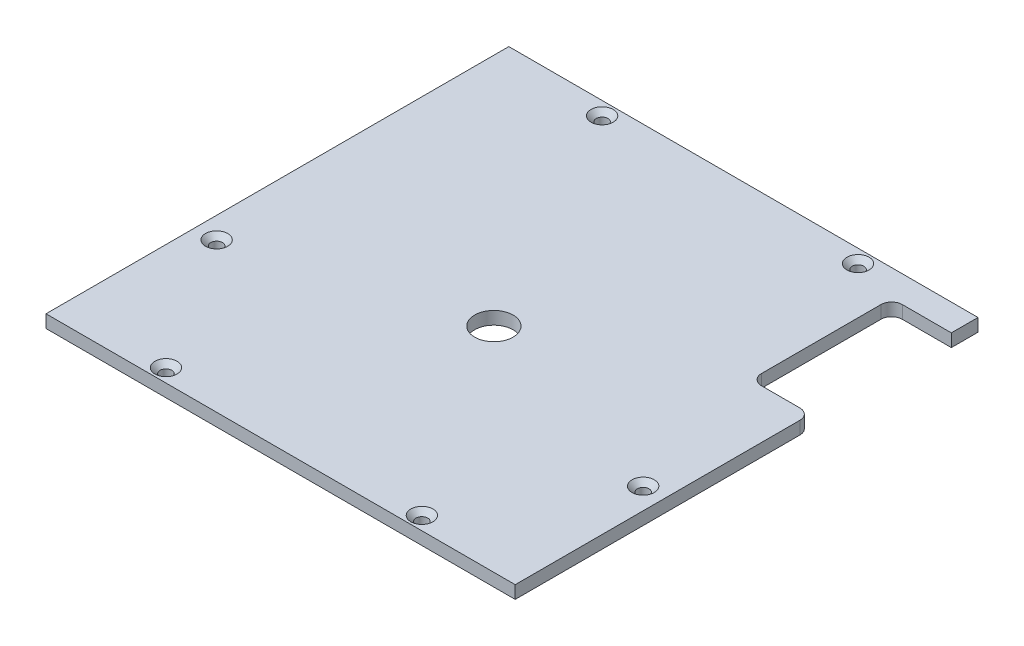
ISO-10303-21;
HEADER;
FILE_DESCRIPTION(('STEP AP214'),'2;1');
FILE_NAME('part.step','',(''),(''),'','','');
FILE_SCHEMA(('AUTOMOTIVE_DESIGN { 1 0 10303 214 1 1 1 1 }'));
ENDSEC;
DATA;
#1=APPLICATION_CONTEXT('core data for automotive mechanical design processes');
#2=APPLICATION_PROTOCOL_DEFINITION('international standard','automotive_design',2000,#1);
#3=PRODUCT_CONTEXT('',#1,'mechanical');
#4=PRODUCT('Part','Part','',(#3));
#5=PRODUCT_RELATED_PRODUCT_CATEGORY('part','',(#4));
#6=PRODUCT_DEFINITION_FORMATION('','',#4);
#7=PRODUCT_DEFINITION_CONTEXT('part definition',#1,'design');
#8=PRODUCT_DEFINITION('design','',#6,#7);
#9=PRODUCT_DEFINITION_SHAPE('','',#8);
#10=(LENGTH_UNIT() NAMED_UNIT(*) SI_UNIT(.MILLI.,.METRE.));
#11=(NAMED_UNIT(*) PLANE_ANGLE_UNIT() SI_UNIT($,.RADIAN.));
#12=(NAMED_UNIT(*) SI_UNIT($,.STERADIAN.) SOLID_ANGLE_UNIT());
#13=UNCERTAINTY_MEASURE_WITH_UNIT(LENGTH_MEASURE(1.E-05),#10,'distance_accuracy_value','');
#14=(GEOMETRIC_REPRESENTATION_CONTEXT(3) GLOBAL_UNCERTAINTY_ASSIGNED_CONTEXT((#13)) GLOBAL_UNIT_ASSIGNED_CONTEXT((#10,
#11,#12)) REPRESENTATION_CONTEXT('',''));
#15=CARTESIAN_POINT('',(0.,0.,0.));
#16=DIRECTION('',(0.,0.,1.));
#17=DIRECTION('',(1.,0.,0.));
#18=AXIS2_PLACEMENT_3D('',#15,#16,#17);
#19=CARTESIAN_POINT('',(0.,6.,0.));
#20=DIRECTION('',(0.,-1.,0.));
#21=DIRECTION('',(0.,0.,-1.));
#22=AXIS2_PLACEMENT_3D('',#19,#20,#21);
#23=PLANE('',#22);
#24=CARTESIAN_POINT('',(-100.,6.,38.5));
#25=DIRECTION('',(0.,1.,0.));
#26=DIRECTION('',(0.,0.,1.));
#27=AXIS2_PLACEMENT_3D('',#24,#25,#26);
#28=CIRCLE('',#27,5.2);
#29=CARTESIAN_POINT('',(-100.,6.,43.7));
#30=VERTEX_POINT('',#29);
#31=EDGE_CURVE('E486',#30,#30,#28,.T.);
#32=ORIENTED_EDGE('',*,*,#31,.F.);
#33=EDGE_LOOP('',(#32));
#34=FACE_BOUND('',#33,.T.);
#35=CARTESIAN_POINT('',(-60.,6.,102.25));
#36=DIRECTION('',(0.,1.,0.));
#37=DIRECTION('',(0.,0.,1.));
#38=AXIS2_PLACEMENT_3D('',#35,#36,#37);
#39=CIRCLE('',#38,5.2);
#40=CARTESIAN_POINT('',(-60.,6.,107.45));
#41=VERTEX_POINT('',#40);
#42=EDGE_CURVE('E493',#41,#41,#39,.T.);
#43=ORIENTED_EDGE('',*,*,#42,.F.);
#44=EDGE_LOOP('',(#43));
#45=FACE_BOUND('',#44,.T.);
#46=CARTESIAN_POINT('',(60.,6.,102.25));
#47=DIRECTION('',(0.,1.,0.));
#48=DIRECTION('',(0.,0.,1.));
#49=AXIS2_PLACEMENT_3D('',#46,#47,#48);
#50=CIRCLE('',#49,5.2);
#51=CARTESIAN_POINT('',(60.,6.,107.45));
#52=VERTEX_POINT('',#51);
#53=EDGE_CURVE('E502',#52,#52,#50,.T.);
#54=ORIENTED_EDGE('',*,*,#53,.F.);
#55=EDGE_LOOP('',(#54));
#56=FACE_BOUND('',#55,.T.);
#57=CARTESIAN_POINT('',(100.,6.,38.5));
#58=DIRECTION('',(0.,1.,0.));
#59=DIRECTION('',(0.,0.,1.));
#60=AXIS2_PLACEMENT_3D('',#57,#58,#59);
#61=CIRCLE('',#60,5.2);
#62=CARTESIAN_POINT('',(100.,6.,43.7));
#63=VERTEX_POINT('',#62);
#64=EDGE_CURVE('E511',#63,#63,#61,.T.);
#65=ORIENTED_EDGE('',*,*,#64,.F.);
#66=EDGE_LOOP('',(#65));
#67=FACE_BOUND('',#66,.T.);
#68=CARTESIAN_POINT('',(60.,6.,-102.25));
#69=DIRECTION('',(0.,1.,0.));
#70=DIRECTION('',(0.,0.,1.));
#71=AXIS2_PLACEMENT_3D('',#68,#69,#70);
#72=CIRCLE('',#71,5.2);
#73=CARTESIAN_POINT('',(60.,6.,-97.05));
#74=VERTEX_POINT('',#73);
#75=EDGE_CURVE('E529',#74,#74,#72,.T.);
#76=ORIENTED_EDGE('',*,*,#75,.F.);
#77=EDGE_LOOP('',(#76));
#78=FACE_BOUND('',#77,.T.);
#79=CARTESIAN_POINT('',(0.,6.,8.49999999999996));
#80=DIRECTION('',(0.,1.,0.));
#81=DIRECTION('',(0.,0.,1.));
#82=AXIS2_PLACEMENT_3D('',#79,#80,#81);
#83=CIRCLE('',#82,9.);
#84=CARTESIAN_POINT('',(0.,6.,17.5));
#85=VERTEX_POINT('',#84);
#86=EDGE_CURVE('E210',#85,#85,#83,.T.);
#87=ORIENTED_EDGE('',*,*,#86,.F.);
#88=EDGE_LOOP('',(#87));
#89=FACE_BOUND('',#88,.T.);
#90=DIRECTION('',(0.,0.,-1.));
#91=VECTOR('',#90,1.);
#92=CARTESIAN_POINT('',(110.,6.,108.5));
#93=LINE('',#92,#91);
#94=CARTESIAN_POINT('',(110.,6.,108.5));
#95=VERTEX_POINT('',#94);
#96=CARTESIAN_POINT('',(110.,6.,-25.));
#97=VERTEX_POINT('',#96);
#98=EDGE_CURVE('E213',#95,#97,#93,.T.);
#99=ORIENTED_EDGE('',*,*,#98,.T.);
#100=CARTESIAN_POINT('',(105.,6.,-25.));
#101=DIRECTION('',(0.,-1.,0.));
#102=DIRECTION('',(0.,0.,-1.));
#103=AXIS2_PLACEMENT_3D('',#100,#101,#102);
#104=CIRCLE('',#103,5.);
#105=CARTESIAN_POINT('',(105.,6.,-30.));
#106=VERTEX_POINT('',#105);
#107=EDGE_CURVE('E168',#97,#106,#104,.F.);
#108=ORIENTED_EDGE('',*,*,#107,.T.);
#109=DIRECTION('',(1.,0.,0.));
#110=VECTOR('',#109,1.);
#111=CARTESIAN_POINT('',(82.,6.,-30.));
#112=LINE('',#111,#110);
#113=CARTESIAN_POINT('',(87.,6.,-30.));
#114=VERTEX_POINT('',#113);
#115=EDGE_CURVE('E194',#114,#106,#112,.T.);
#116=ORIENTED_EDGE('',*,*,#115,.F.);
#117=CARTESIAN_POINT('',(87.,6.,-35.));
#118=DIRECTION('',(0.,-1.,0.));
#119=DIRECTION('',(0.,0.,-1.));
#120=AXIS2_PLACEMENT_3D('',#117,#118,#119);
#121=CIRCLE('',#120,5.);
#122=CARTESIAN_POINT('',(82.,6.,-35.));
#123=VERTEX_POINT('',#122);
#124=EDGE_CURVE('E182',#114,#123,#121,.T.);
#125=ORIENTED_EDGE('',*,*,#124,.T.);
#126=DIRECTION('',(0.,0.,1.));
#127=VECTOR('',#126,1.);
#128=CARTESIAN_POINT('',(82.,6.,-96.));
#129=LINE('',#128,#127);
#130=CARTESIAN_POINT('',(82.,6.,-91.));
#131=VERTEX_POINT('',#130);
#132=EDGE_CURVE('E190',#131,#123,#129,.T.);
#133=ORIENTED_EDGE('',*,*,#132,.F.);
#134=CARTESIAN_POINT('',(87.,6.,-91.));
#135=DIRECTION('',(0.,-1.,0.));
#136=DIRECTION('',(0.,0.,-1.));
#137=AXIS2_PLACEMENT_3D('',#134,#135,#136);
#138=CIRCLE('',#137,5.);
#139=CARTESIAN_POINT('',(87.,6.,-96.));
#140=VERTEX_POINT('',#139);
#141=EDGE_CURVE('E44',#131,#140,#138,.T.);
#142=ORIENTED_EDGE('',*,*,#141,.T.);
#143=DIRECTION('',(-1.,0.,0.));
#144=VECTOR('',#143,1.);
#145=CARTESIAN_POINT('',(82.,6.,-96.));
#146=LINE('',#145,#144);
#147=CARTESIAN_POINT('',(110.,6.,-96.));
#148=VERTEX_POINT('',#147);
#149=EDGE_CURVE('E189',#148,#140,#146,.T.);
#150=ORIENTED_EDGE('',*,*,#149,.F.);
#151=CARTESIAN_POINT('',(110.,6.,-108.5));
#152=VERTEX_POINT('',#151);
#153=EDGE_CURVE('E134',#148,#152,#93,.T.);
#154=ORIENTED_EDGE('',*,*,#153,.T.);
#155=DIRECTION('',(-1.,0.,0.));
#156=VECTOR('',#155,1.);
#157=CARTESIAN_POINT('',(-110.,6.,-108.5));
#158=LINE('',#157,#156);
#159=CARTESIAN_POINT('',(-110.,6.,-108.5));
#160=VERTEX_POINT('',#159);
#161=EDGE_CURVE('E215',#152,#160,#158,.T.);
#162=ORIENTED_EDGE('',*,*,#161,.T.);
#163=DIRECTION('',(0.,0.,1.));
#164=VECTOR('',#163,1.);
#165=CARTESIAN_POINT('',(-110.,6.,108.5));
#166=LINE('',#165,#164);
#167=CARTESIAN_POINT('',(-110.,6.,108.5));
#168=VERTEX_POINT('',#167);
#169=EDGE_CURVE('E216',#160,#168,#166,.T.);
#170=ORIENTED_EDGE('',*,*,#169,.T.);
#171=DIRECTION('',(1.,0.,0.));
#172=VECTOR('',#171,1.);
#173=CARTESIAN_POINT('',(-110.,6.,108.5));
#174=LINE('',#173,#172);
#175=EDGE_CURVE('E147',#168,#95,#174,.T.);
#176=ORIENTED_EDGE('',*,*,#175,.T.);
#177=EDGE_LOOP('',(#99,#108,#116,#125,#133,#142,#150,#154,#162,#170,#176));
#178=FACE_BOUND('',#177,.T.);
#179=CARTESIAN_POINT('',(-60.,6.,-102.25));
#180=DIRECTION('',(0.,1.,0.));
#181=DIRECTION('',(0.,0.,1.));
#182=AXIS2_PLACEMENT_3D('',#179,#180,#181);
#183=CIRCLE('',#182,5.2);
#184=CARTESIAN_POINT('',(-60.,6.,-97.05));
#185=VERTEX_POINT('',#184);
#186=EDGE_CURVE('E520',#185,#185,#183,.T.);
#187=ORIENTED_EDGE('',*,*,#186,.F.);
#188=EDGE_LOOP('',(#187));
#189=FACE_BOUND('',#188,.T.);
#190=ADVANCED_FACE('F36',(#34,#45,#56,#67,#78,#89,#178,#189),#23,.F.);
#191=CARTESIAN_POINT('',(110.,6.,108.5));
#192=DIRECTION('',(-1.,0.,0.));
#193=DIRECTION('',(0.,0.,1.));
#194=AXIS2_PLACEMENT_3D('',#191,#192,#193);
#195=PLANE('',#194);
#196=ORIENTED_EDGE('',*,*,#153,.F.);
#197=DIRECTION('',(0.,1.,0.));
#198=VECTOR('',#197,1.);
#199=CARTESIAN_POINT('',(110.,0.,-96.));
#200=LINE('',#199,#198);
#201=CARTESIAN_POINT('',(110.,0.,-96.));
#202=VERTEX_POINT('',#201);
#203=EDGE_CURVE('E121',#202,#148,#200,.T.);
#204=ORIENTED_EDGE('',*,*,#203,.F.);
#205=DIRECTION('',(0.,0.,-1.));
#206=VECTOR('',#205,1.);
#207=CARTESIAN_POINT('',(110.,0.,108.5));
#208=LINE('',#207,#206);
#209=CARTESIAN_POINT('',(110.,0.,-108.5));
#210=VERTEX_POINT('',#209);
#211=EDGE_CURVE('E132',#202,#210,#208,.T.);
#212=ORIENTED_EDGE('',*,*,#211,.T.);
#213=DIRECTION('',(0.,-1.,0.));
#214=VECTOR('',#213,1.);
#215=CARTESIAN_POINT('',(110.,6.,-108.5));
#216=LINE('',#215,#214);
#217=EDGE_CURVE('E163',#152,#210,#216,.T.);
#218=ORIENTED_EDGE('',*,*,#217,.F.);
#219=EDGE_LOOP('',(#196,#204,#212,#218));
#220=FACE_BOUND('',#219,.T.);
#221=ADVANCED_FACE('F130',(#220),#195,.F.);
#222=CARTESIAN_POINT('',(110.,0.,108.5));
#223=VERTEX_POINT('',#222);
#224=CARTESIAN_POINT('',(110.,0.,-25.));
#225=VERTEX_POINT('',#224);
#226=EDGE_CURVE('E142',#223,#225,#208,.T.);
#227=ORIENTED_EDGE('',*,*,#226,.T.);
#228=DIRECTION('',(0.,1.,0.));
#229=VECTOR('',#228,1.);
#230=CARTESIAN_POINT('',(110.,6.,-25.));
#231=LINE('',#230,#229);
#232=EDGE_CURVE('E165',#225,#97,#231,.T.);
#233=ORIENTED_EDGE('',*,*,#232,.T.);
#234=ORIENTED_EDGE('',*,*,#98,.F.);
#235=DIRECTION('',(0.,-1.,0.));
#236=VECTOR('',#235,1.);
#237=CARTESIAN_POINT('',(110.,6.,108.5));
#238=LINE('',#237,#236);
#239=EDGE_CURVE('E154',#95,#223,#238,.T.);
#240=ORIENTED_EDGE('',*,*,#239,.T.);
#241=EDGE_LOOP('',(#227,#233,#234,#240));
#242=FACE_BOUND('',#241,.T.);
#243=ADVANCED_FACE('F227',(#242),#195,.F.);
#244=CARTESIAN_POINT('',(-110.,6.,-108.5));
#245=DIRECTION('',(0.,0.,1.));
#246=DIRECTION('',(1.,0.,0.));
#247=AXIS2_PLACEMENT_3D('',#244,#245,#246);
#248=PLANE('',#247);
#249=DIRECTION('',(-1.,0.,0.));
#250=VECTOR('',#249,1.);
#251=CARTESIAN_POINT('',(-110.,0.,-108.5));
#252=LINE('',#251,#250);
#253=CARTESIAN_POINT('',(-110.,0.,-108.5));
#254=VERTEX_POINT('',#253);
#255=EDGE_CURVE('E140',#210,#254,#252,.T.);
#256=ORIENTED_EDGE('',*,*,#255,.T.);
#257=DIRECTION('',(0.,-1.,0.));
#258=VECTOR('',#257,1.);
#259=CARTESIAN_POINT('',(-110.,6.,-108.5));
#260=LINE('',#259,#258);
#261=EDGE_CURVE('E160',#160,#254,#260,.T.);
#262=ORIENTED_EDGE('',*,*,#261,.F.);
#263=ORIENTED_EDGE('',*,*,#161,.F.);
#264=ORIENTED_EDGE('',*,*,#217,.T.);
#265=EDGE_LOOP('',(#256,#262,#263,#264));
#266=FACE_BOUND('',#265,.T.);
#267=ADVANCED_FACE('F245',(#266),#248,.F.);
#268=CARTESIAN_POINT('',(-110.,6.,108.5));
#269=DIRECTION('',(1.,0.,0.));
#270=DIRECTION('',(0.,0.,-1.));
#271=AXIS2_PLACEMENT_3D('',#268,#269,#270);
#272=PLANE('',#271);
#273=DIRECTION('',(0.,0.,1.));
#274=VECTOR('',#273,1.);
#275=CARTESIAN_POINT('',(-110.,0.,108.5));
#276=LINE('',#275,#274);
#277=CARTESIAN_POINT('',(-110.,0.,108.5));
#278=VERTEX_POINT('',#277);
#279=EDGE_CURVE('E150',#254,#278,#276,.T.);
#280=ORIENTED_EDGE('',*,*,#279,.T.);
#281=DIRECTION('',(0.,-1.,0.));
#282=VECTOR('',#281,1.);
#283=CARTESIAN_POINT('',(-110.,6.,108.5));
#284=LINE('',#283,#282);
#285=EDGE_CURVE('E157',#168,#278,#284,.T.);
#286=ORIENTED_EDGE('',*,*,#285,.F.);
#287=ORIENTED_EDGE('',*,*,#169,.F.);
#288=ORIENTED_EDGE('',*,*,#261,.T.);
#289=EDGE_LOOP('',(#280,#286,#287,#288));
#290=FACE_BOUND('',#289,.T.);
#291=ADVANCED_FACE('F241',(#290),#272,.F.);
#292=CARTESIAN_POINT('',(-110.,6.,108.5));
#293=DIRECTION('',(0.,0.,-1.));
#294=DIRECTION('',(-1.,0.,0.));
#295=AXIS2_PLACEMENT_3D('',#292,#293,#294);
#296=PLANE('',#295);
#297=DIRECTION('',(1.,0.,0.));
#298=VECTOR('',#297,1.);
#299=CARTESIAN_POINT('',(-110.,0.,108.5));
#300=LINE('',#299,#298);
#301=EDGE_CURVE('E152',#278,#223,#300,.T.);
#302=ORIENTED_EDGE('',*,*,#301,.T.);
#303=ORIENTED_EDGE('',*,*,#239,.F.);
#304=ORIENTED_EDGE('',*,*,#175,.F.);
#305=ORIENTED_EDGE('',*,*,#285,.T.);
#306=EDGE_LOOP('',(#302,#303,#304,#305));
#307=FACE_BOUND('',#306,.T.);
#308=ADVANCED_FACE('F223',(#307),#296,.F.);
#309=CARTESIAN_POINT('',(0.,0.,0.));
#310=DIRECTION('',(0.,-1.,0.));
#311=DIRECTION('',(0.,0.,-1.));
#312=AXIS2_PLACEMENT_3D('',#309,#310,#311);
#313=PLANE('',#312);
#314=CARTESIAN_POINT('',(-100.,0.,38.5));
#315=DIRECTION('',(0.,1.,0.));
#316=DIRECTION('',(0.,0.,1.));
#317=AXIS2_PLACEMENT_3D('',#314,#315,#316);
#318=CIRCLE('',#317,2.74999999999999);
#319=CARTESIAN_POINT('',(-100.,0.,41.25));
#320=VERTEX_POINT('',#319);
#321=EDGE_CURVE('E488',#320,#320,#318,.T.);
#322=ORIENTED_EDGE('',*,*,#321,.T.);
#323=EDGE_LOOP('',(#322));
#324=FACE_BOUND('',#323,.T.);
#325=CARTESIAN_POINT('',(-60.,0.,102.25));
#326=DIRECTION('',(0.,1.,0.));
#327=DIRECTION('',(0.,0.,1.));
#328=AXIS2_PLACEMENT_3D('',#325,#326,#327);
#329=CIRCLE('',#328,2.74999999999999);
#330=CARTESIAN_POINT('',(-60.,0.,105.));
#331=VERTEX_POINT('',#330);
#332=EDGE_CURVE('E499',#331,#331,#329,.T.);
#333=ORIENTED_EDGE('',*,*,#332,.T.);
#334=EDGE_LOOP('',(#333));
#335=FACE_BOUND('',#334,.T.);
#336=CARTESIAN_POINT('',(60.,0.,102.25));
#337=DIRECTION('',(0.,1.,0.));
#338=DIRECTION('',(0.,0.,1.));
#339=AXIS2_PLACEMENT_3D('',#336,#337,#338);
#340=CIRCLE('',#339,2.74999999999999);
#341=CARTESIAN_POINT('',(60.,0.,105.));
#342=VERTEX_POINT('',#341);
#343=EDGE_CURVE('E508',#342,#342,#340,.T.);
#344=ORIENTED_EDGE('',*,*,#343,.T.);
#345=EDGE_LOOP('',(#344));
#346=FACE_BOUND('',#345,.T.);
#347=CARTESIAN_POINT('',(100.,0.,38.5));
#348=DIRECTION('',(0.,1.,0.));
#349=DIRECTION('',(0.,0.,1.));
#350=AXIS2_PLACEMENT_3D('',#347,#348,#349);
#351=CIRCLE('',#350,2.74999999999999);
#352=CARTESIAN_POINT('',(100.,0.,41.25));
#353=VERTEX_POINT('',#352);
#354=EDGE_CURVE('E517',#353,#353,#351,.T.);
#355=ORIENTED_EDGE('',*,*,#354,.T.);
#356=EDGE_LOOP('',(#355));
#357=FACE_BOUND('',#356,.T.);
#358=CARTESIAN_POINT('',(-60.,0.,-102.25));
#359=DIRECTION('',(0.,1.,0.));
#360=DIRECTION('',(0.,0.,1.));
#361=AXIS2_PLACEMENT_3D('',#358,#359,#360);
#362=CIRCLE('',#361,2.74999999999999);
#363=CARTESIAN_POINT('',(-60.,0.,-99.5));
#364=VERTEX_POINT('',#363);
#365=EDGE_CURVE('E526',#364,#364,#362,.T.);
#366=ORIENTED_EDGE('',*,*,#365,.T.);
#367=EDGE_LOOP('',(#366));
#368=FACE_BOUND('',#367,.T.);
#369=CARTESIAN_POINT('',(60.,0.,-102.25));
#370=DIRECTION('',(0.,1.,0.));
#371=DIRECTION('',(0.,0.,1.));
#372=AXIS2_PLACEMENT_3D('',#369,#370,#371);
#373=CIRCLE('',#372,2.74999999999999);
#374=CARTESIAN_POINT('',(60.,0.,-99.5));
#375=VERTEX_POINT('',#374);
#376=EDGE_CURVE('E201',#375,#375,#373,.T.);
#377=ORIENTED_EDGE('',*,*,#376,.T.);
#378=EDGE_LOOP('',(#377));
#379=FACE_BOUND('',#378,.T.);
#380=DIRECTION('',(1.,0.,0.));
#381=VECTOR('',#380,1.);
#382=CARTESIAN_POINT('',(82.,0.,-30.));
#383=LINE('',#382,#381);
#384=CARTESIAN_POINT('',(87.,0.,-30.));
#385=VERTEX_POINT('',#384);
#386=CARTESIAN_POINT('',(105.,0.,-30.));
#387=VERTEX_POINT('',#386);
#388=EDGE_CURVE('E126',#385,#387,#383,.T.);
#389=ORIENTED_EDGE('',*,*,#388,.T.);
#390=CARTESIAN_POINT('',(105.,0.,-25.));
#391=DIRECTION('',(0.,-1.,0.));
#392=DIRECTION('',(0.,0.,-1.));
#393=AXIS2_PLACEMENT_3D('',#390,#391,#392);
#394=CIRCLE('',#393,5.);
#395=EDGE_CURVE('E175',#387,#225,#394,.T.);
#396=ORIENTED_EDGE('',*,*,#395,.T.);
#397=ORIENTED_EDGE('',*,*,#226,.F.);
#398=ORIENTED_EDGE('',*,*,#301,.F.);
#399=ORIENTED_EDGE('',*,*,#279,.F.);
#400=ORIENTED_EDGE('',*,*,#255,.F.);
#401=ORIENTED_EDGE('',*,*,#211,.F.);
#402=DIRECTION('',(-1.,0.,0.));
#403=VECTOR('',#402,1.);
#404=CARTESIAN_POINT('',(82.,0.,-96.));
#405=LINE('',#404,#403);
#406=CARTESIAN_POINT('',(87.,0.,-96.));
#407=VERTEX_POINT('',#406);
#408=EDGE_CURVE('E117',#202,#407,#405,.T.);
#409=ORIENTED_EDGE('',*,*,#408,.T.);
#410=CARTESIAN_POINT('',(87.,0.,-91.));
#411=DIRECTION('',(0.,-1.,0.));
#412=DIRECTION('',(0.,0.,-1.));
#413=AXIS2_PLACEMENT_3D('',#410,#411,#412);
#414=CIRCLE('',#413,5.);
#415=CARTESIAN_POINT('',(82.,0.,-91.));
#416=VERTEX_POINT('',#415);
#417=EDGE_CURVE('E11',#407,#416,#414,.F.);
#418=ORIENTED_EDGE('',*,*,#417,.T.);
#419=DIRECTION('',(0.,0.,1.));
#420=VECTOR('',#419,1.);
#421=CARTESIAN_POINT('',(82.,0.,-96.));
#422=LINE('',#421,#420);
#423=CARTESIAN_POINT('',(82.,0.,-35.));
#424=VERTEX_POINT('',#423);
#425=EDGE_CURVE('E193',#416,#424,#422,.T.);
#426=ORIENTED_EDGE('',*,*,#425,.T.);
#427=CARTESIAN_POINT('',(87.,0.,-35.));
#428=DIRECTION('',(0.,-1.,0.));
#429=DIRECTION('',(0.,0.,-1.));
#430=AXIS2_PLACEMENT_3D('',#427,#428,#429);
#431=CIRCLE('',#430,5.);
#432=EDGE_CURVE('E184',#424,#385,#431,.F.);
#433=ORIENTED_EDGE('',*,*,#432,.T.);
#434=EDGE_LOOP('',(#389,#396,#397,#398,#399,#400,#401,#409,#418,#426,#433));
#435=FACE_BOUND('',#434,.T.);
#436=CARTESIAN_POINT('',(0.,0.,8.49999999999996));
#437=DIRECTION('',(0.,1.,0.));
#438=DIRECTION('',(0.,0.,1.));
#439=AXIS2_PLACEMENT_3D('',#436,#437,#438);
#440=CIRCLE('',#439,9.);
#441=CARTESIAN_POINT('',(0.,0.,17.5));
#442=VERTEX_POINT('',#441);
#443=EDGE_CURVE('E205',#442,#442,#440,.T.);
#444=ORIENTED_EDGE('',*,*,#443,.T.);
#445=EDGE_LOOP('',(#444));
#446=FACE_BOUND('',#445,.T.);
#447=ADVANCED_FACE('F137',(#324,#335,#346,#357,#368,#379,#435,#446),#313,.T.);
#448=CARTESIAN_POINT('',(0.,0.,8.49999999999996));
#449=DIRECTION('',(0.,1.,0.));
#450=DIRECTION('',(0.,0.,1.));
#451=AXIS2_PLACEMENT_3D('',#448,#449,#450);
#452=CYLINDRICAL_SURFACE('',#451,9.);
#453=ORIENTED_EDGE('',*,*,#443,.F.);
#454=EDGE_LOOP('',(#453));
#455=FACE_BOUND('',#454,.T.);
#456=ORIENTED_EDGE('',*,*,#86,.T.);
#457=EDGE_LOOP('',(#456));
#458=FACE_BOUND('',#457,.T.);
#459=ADVANCED_FACE('F264',(#455,#458),#452,.F.);
#460=CARTESIAN_POINT('',(82.,0.,-96.));
#461=DIRECTION('',(-1.,0.,0.));
#462=DIRECTION('',(0.,0.,1.));
#463=AXIS2_PLACEMENT_3D('',#460,#461,#462);
#464=PLANE('',#463);
#465=ORIENTED_EDGE('',*,*,#132,.T.);
#466=DIRECTION('',(0.,1.,0.));
#467=VECTOR('',#466,1.);
#468=CARTESIAN_POINT('',(82.,0.,-35.));
#469=LINE('',#468,#467);
#470=EDGE_CURVE('E51',#123,#424,#469,.F.);
#471=ORIENTED_EDGE('',*,*,#470,.T.);
#472=ORIENTED_EDGE('',*,*,#425,.F.);
#473=DIRECTION('',(0.,1.,0.));
#474=VECTOR('',#473,1.);
#475=CARTESIAN_POINT('',(82.,6.,-91.));
#476=LINE('',#475,#474);
#477=EDGE_CURVE('E177',#416,#131,#476,.T.);
#478=ORIENTED_EDGE('',*,*,#477,.T.);
#479=EDGE_LOOP('',(#465,#471,#472,#478));
#480=FACE_BOUND('',#479,.T.);
#481=ADVANCED_FACE('F196',(#480),#464,.F.);
#482=CARTESIAN_POINT('',(82.,0.,-96.));
#483=DIRECTION('',(0.,0.,-1.));
#484=DIRECTION('',(-1.,0.,0.));
#485=AXIS2_PLACEMENT_3D('',#482,#483,#484);
#486=PLANE('',#485);
#487=ORIENTED_EDGE('',*,*,#149,.T.);
#488=DIRECTION('',(0.,1.,0.));
#489=VECTOR('',#488,1.);
#490=CARTESIAN_POINT('',(87.,0.,-96.));
#491=LINE('',#490,#489);
#492=EDGE_CURVE('E124',#140,#407,#491,.F.);
#493=ORIENTED_EDGE('',*,*,#492,.T.);
#494=ORIENTED_EDGE('',*,*,#408,.F.);
#495=ORIENTED_EDGE('',*,*,#203,.T.);
#496=EDGE_LOOP('',(#487,#493,#494,#495));
#497=FACE_BOUND('',#496,.T.);
#498=ADVANCED_FACE('F120',(#497),#486,.F.);
#499=CARTESIAN_POINT('',(82.,0.,-30.));
#500=DIRECTION('',(0.,0.,1.));
#501=DIRECTION('',(1.,0.,0.));
#502=AXIS2_PLACEMENT_3D('',#499,#500,#501);
#503=PLANE('',#502);
#504=ORIENTED_EDGE('',*,*,#115,.T.);
#505=DIRECTION('',(0.,1.,0.));
#506=VECTOR('',#505,1.);
#507=CARTESIAN_POINT('',(105.,0.,-30.));
#508=LINE('',#507,#506);
#509=EDGE_CURVE('E173',#106,#387,#508,.F.);
#510=ORIENTED_EDGE('',*,*,#509,.T.);
#511=ORIENTED_EDGE('',*,*,#388,.F.);
#512=DIRECTION('',(0.,1.,0.));
#513=VECTOR('',#512,1.);
#514=CARTESIAN_POINT('',(87.,6.,-30.));
#515=LINE('',#514,#513);
#516=EDGE_CURVE('E170',#385,#114,#515,.T.);
#517=ORIENTED_EDGE('',*,*,#516,.T.);
#518=EDGE_LOOP('',(#504,#510,#511,#517));
#519=FACE_BOUND('',#518,.T.);
#520=ADVANCED_FACE('F235',(#519),#503,.F.);
#521=CARTESIAN_POINT('',(105.,6.,-25.));
#522=DIRECTION('',(0.,1.,0.));
#523=DIRECTION('',(0.,0.,1.));
#524=AXIS2_PLACEMENT_3D('',#521,#522,#523);
#525=CYLINDRICAL_SURFACE('',#524,5.);
#526=ORIENTED_EDGE('',*,*,#395,.F.);
#527=ORIENTED_EDGE('',*,*,#509,.F.);
#528=ORIENTED_EDGE('',*,*,#107,.F.);
#529=ORIENTED_EDGE('',*,*,#232,.F.);
#530=EDGE_LOOP('',(#526,#527,#528,#529));
#531=FACE_BOUND('',#530,.T.);
#532=ADVANCED_FACE('F231',(#531),#525,.T.);
#533=CARTESIAN_POINT('',(87.,0.,-35.));
#534=DIRECTION('',(0.,-1.,0.));
#535=DIRECTION('',(0.,0.,-1.));
#536=AXIS2_PLACEMENT_3D('',#533,#534,#535);
#537=CYLINDRICAL_SURFACE('',#536,5.);
#538=ORIENTED_EDGE('',*,*,#432,.F.);
#539=ORIENTED_EDGE('',*,*,#470,.F.);
#540=ORIENTED_EDGE('',*,*,#124,.F.);
#541=ORIENTED_EDGE('',*,*,#516,.F.);
#542=EDGE_LOOP('',(#538,#539,#540,#541));
#543=FACE_BOUND('',#542,.T.);
#544=ADVANCED_FACE('F239',(#543),#537,.F.);
#545=CARTESIAN_POINT('',(87.,0.,-91.));
#546=DIRECTION('',(0.,-1.,0.));
#547=DIRECTION('',(0.,0.,-1.));
#548=AXIS2_PLACEMENT_3D('',#545,#546,#547);
#549=CYLINDRICAL_SURFACE('',#548,5.);
#550=ORIENTED_EDGE('',*,*,#417,.F.);
#551=ORIENTED_EDGE('',*,*,#492,.F.);
#552=ORIENTED_EDGE('',*,*,#141,.F.);
#553=ORIENTED_EDGE('',*,*,#477,.F.);
#554=EDGE_LOOP('',(#550,#551,#552,#553));
#555=FACE_BOUND('',#554,.T.);
#556=ADVANCED_FACE('F38',(#555),#549,.F.);
#557=CARTESIAN_POINT('',(60.,6.,-102.25));
#558=DIRECTION('',(0.,1.,0.));
#559=DIRECTION('',(0.,0.,1.));
#560=AXIS2_PLACEMENT_3D('',#557,#558,#559);
#561=CYLINDRICAL_SURFACE('',#560,2.75);
#562=ORIENTED_EDGE('',*,*,#376,.F.);
#563=EDGE_LOOP('',(#562));
#564=FACE_BOUND('',#563,.T.);
#565=CARTESIAN_POINT('',(60.,3.55,-102.25));
#566=DIRECTION('',(0.,1.,0.));
#567=DIRECTION('',(0.,0.,1.));
#568=AXIS2_PLACEMENT_3D('',#565,#566,#567);
#569=CIRCLE('',#568,2.75);
#570=CARTESIAN_POINT('',(60.,3.55,-99.5));
#571=VERTEX_POINT('',#570);
#572=EDGE_CURVE('E531',#571,#571,#569,.T.);
#573=ORIENTED_EDGE('',*,*,#572,.T.);
#574=EDGE_LOOP('',(#573));
#575=FACE_BOUND('',#574,.T.);
#576=ADVANCED_FACE('F321',(#564,#575),#561,.F.);
#577=CARTESIAN_POINT('',(60.,6.,-102.25));
#578=DIRECTION('',(0.,1.,0.));
#579=DIRECTION('',(0.,0.,1.));
#580=AXIS2_PLACEMENT_3D('',#577,#578,#579);
#581=CONICAL_SURFACE('',#580,5.2,0.785398163397447);
#582=ORIENTED_EDGE('',*,*,#572,.F.);
#583=EDGE_LOOP('',(#582));
#584=FACE_BOUND('',#583,.T.);
#585=ORIENTED_EDGE('',*,*,#75,.T.);
#586=EDGE_LOOP('',(#585));
#587=FACE_BOUND('',#586,.T.);
#588=ADVANCED_FACE('F326',(#584,#587),#581,.F.);
#589=CARTESIAN_POINT('',(-60.,6.,-102.25));
#590=DIRECTION('',(0.,1.,0.));
#591=DIRECTION('',(0.,0.,1.));
#592=AXIS2_PLACEMENT_3D('',#589,#590,#591);
#593=CYLINDRICAL_SURFACE('',#592,2.75);
#594=ORIENTED_EDGE('',*,*,#365,.F.);
#595=EDGE_LOOP('',(#594));
#596=FACE_BOUND('',#595,.T.);
#597=CARTESIAN_POINT('',(-60.,3.55,-102.25));
#598=DIRECTION('',(0.,1.,0.));
#599=DIRECTION('',(0.,0.,1.));
#600=AXIS2_PLACEMENT_3D('',#597,#598,#599);
#601=CIRCLE('',#600,2.75);
#602=CARTESIAN_POINT('',(-60.,3.55,-99.5));
#603=VERTEX_POINT('',#602);
#604=EDGE_CURVE('E523',#603,#603,#601,.T.);
#605=ORIENTED_EDGE('',*,*,#604,.T.);
#606=EDGE_LOOP('',(#605));
#607=FACE_BOUND('',#606,.T.);
#608=ADVANCED_FACE('F334',(#596,#607),#593,.F.);
#609=CARTESIAN_POINT('',(-60.,6.,-102.25));
#610=DIRECTION('',(0.,1.,0.));
#611=DIRECTION('',(0.,0.,1.));
#612=AXIS2_PLACEMENT_3D('',#609,#610,#611);
#613=CONICAL_SURFACE('',#612,5.2,0.785398163397448);
#614=ORIENTED_EDGE('',*,*,#604,.F.);
#615=EDGE_LOOP('',(#614));
#616=FACE_BOUND('',#615,.T.);
#617=ORIENTED_EDGE('',*,*,#186,.T.);
#618=EDGE_LOOP('',(#617));
#619=FACE_BOUND('',#618,.T.);
#620=ADVANCED_FACE('F342',(#616,#619),#613,.F.);
#621=CARTESIAN_POINT('',(100.,6.,38.5));
#622=DIRECTION('',(0.,1.,0.));
#623=DIRECTION('',(0.,0.,1.));
#624=AXIS2_PLACEMENT_3D('',#621,#622,#623);
#625=CYLINDRICAL_SURFACE('',#624,2.75);
#626=ORIENTED_EDGE('',*,*,#354,.F.);
#627=EDGE_LOOP('',(#626));
#628=FACE_BOUND('',#627,.T.);
#629=CARTESIAN_POINT('',(100.,3.55,38.5));
#630=DIRECTION('',(0.,1.,0.));
#631=DIRECTION('',(0.,0.,1.));
#632=AXIS2_PLACEMENT_3D('',#629,#630,#631);
#633=CIRCLE('',#632,2.75);
#634=CARTESIAN_POINT('',(100.,3.55,41.25));
#635=VERTEX_POINT('',#634);
#636=EDGE_CURVE('E514',#635,#635,#633,.T.);
#637=ORIENTED_EDGE('',*,*,#636,.T.);
#638=EDGE_LOOP('',(#637));
#639=FACE_BOUND('',#638,.T.);
#640=ADVANCED_FACE('F350',(#628,#639),#625,.F.);
#641=CARTESIAN_POINT('',(100.,6.,38.5));
#642=DIRECTION('',(0.,1.,0.));
#643=DIRECTION('',(0.,0.,1.));
#644=AXIS2_PLACEMENT_3D('',#641,#642,#643);
#645=CONICAL_SURFACE('',#644,5.2,0.785398163397447);
#646=ORIENTED_EDGE('',*,*,#636,.F.);
#647=EDGE_LOOP('',(#646));
#648=FACE_BOUND('',#647,.T.);
#649=ORIENTED_EDGE('',*,*,#64,.T.);
#650=EDGE_LOOP('',(#649));
#651=FACE_BOUND('',#650,.T.);
#652=ADVANCED_FACE('F358',(#648,#651),#645,.F.);
#653=CARTESIAN_POINT('',(60.,6.,102.25));
#654=DIRECTION('',(0.,1.,0.));
#655=DIRECTION('',(0.,0.,1.));
#656=AXIS2_PLACEMENT_3D('',#653,#654,#655);
#657=CYLINDRICAL_SURFACE('',#656,2.75);
#658=ORIENTED_EDGE('',*,*,#343,.F.);
#659=EDGE_LOOP('',(#658));
#660=FACE_BOUND('',#659,.T.);
#661=CARTESIAN_POINT('',(60.,3.55,102.25));
#662=DIRECTION('',(0.,1.,0.));
#663=DIRECTION('',(0.,0.,1.));
#664=AXIS2_PLACEMENT_3D('',#661,#662,#663);
#665=CIRCLE('',#664,2.75);
#666=CARTESIAN_POINT('',(60.,3.55,105.));
#667=VERTEX_POINT('',#666);
#668=EDGE_CURVE('E505',#667,#667,#665,.T.);
#669=ORIENTED_EDGE('',*,*,#668,.T.);
#670=EDGE_LOOP('',(#669));
#671=FACE_BOUND('',#670,.T.);
#672=ADVANCED_FACE('F366',(#660,#671),#657,.F.);
#673=CARTESIAN_POINT('',(60.,6.,102.25));
#674=DIRECTION('',(0.,1.,0.));
#675=DIRECTION('',(0.,0.,1.));
#676=AXIS2_PLACEMENT_3D('',#673,#674,#675);
#677=CONICAL_SURFACE('',#676,5.2,0.785398163397447);
#678=ORIENTED_EDGE('',*,*,#668,.F.);
#679=EDGE_LOOP('',(#678));
#680=FACE_BOUND('',#679,.T.);
#681=ORIENTED_EDGE('',*,*,#53,.T.);
#682=EDGE_LOOP('',(#681));
#683=FACE_BOUND('',#682,.T.);
#684=ADVANCED_FACE('F374',(#680,#683),#677,.F.);
#685=CARTESIAN_POINT('',(-60.,6.,102.25));
#686=DIRECTION('',(0.,1.,0.));
#687=DIRECTION('',(0.,0.,1.));
#688=AXIS2_PLACEMENT_3D('',#685,#686,#687);
#689=CYLINDRICAL_SURFACE('',#688,2.75);
#690=ORIENTED_EDGE('',*,*,#332,.F.);
#691=EDGE_LOOP('',(#690));
#692=FACE_BOUND('',#691,.T.);
#693=CARTESIAN_POINT('',(-60.,3.55,102.25));
#694=DIRECTION('',(0.,1.,0.));
#695=DIRECTION('',(0.,0.,1.));
#696=AXIS2_PLACEMENT_3D('',#693,#694,#695);
#697=CIRCLE('',#696,2.75);
#698=CARTESIAN_POINT('',(-60.,3.55,105.));
#699=VERTEX_POINT('',#698);
#700=EDGE_CURVE('E496',#699,#699,#697,.T.);
#701=ORIENTED_EDGE('',*,*,#700,.T.);
#702=EDGE_LOOP('',(#701));
#703=FACE_BOUND('',#702,.T.);
#704=ADVANCED_FACE('F382',(#692,#703),#689,.F.);
#705=CARTESIAN_POINT('',(-60.,6.,102.25));
#706=DIRECTION('',(0.,1.,0.));
#707=DIRECTION('',(0.,0.,1.));
#708=AXIS2_PLACEMENT_3D('',#705,#706,#707);
#709=CONICAL_SURFACE('',#708,5.2,0.785398163397448);
#710=ORIENTED_EDGE('',*,*,#700,.F.);
#711=EDGE_LOOP('',(#710));
#712=FACE_BOUND('',#711,.T.);
#713=ORIENTED_EDGE('',*,*,#42,.T.);
#714=EDGE_LOOP('',(#713));
#715=FACE_BOUND('',#714,.T.);
#716=ADVANCED_FACE('F390',(#712,#715),#709,.F.);
#717=CARTESIAN_POINT('',(-100.,6.,38.5));
#718=DIRECTION('',(0.,1.,0.));
#719=DIRECTION('',(0.,0.,1.));
#720=AXIS2_PLACEMENT_3D('',#717,#718,#719);
#721=CYLINDRICAL_SURFACE('',#720,2.75);
#722=ORIENTED_EDGE('',*,*,#321,.F.);
#723=EDGE_LOOP('',(#722));
#724=FACE_BOUND('',#723,.T.);
#725=CARTESIAN_POINT('',(-100.,3.55,38.5));
#726=DIRECTION('',(0.,1.,0.));
#727=DIRECTION('',(0.,0.,1.));
#728=AXIS2_PLACEMENT_3D('',#725,#726,#727);
#729=CIRCLE('',#728,2.75);
#730=CARTESIAN_POINT('',(-100.,3.55,41.25));
#731=VERTEX_POINT('',#730);
#732=EDGE_CURVE('E484',#731,#731,#729,.T.);
#733=ORIENTED_EDGE('',*,*,#732,.T.);
#734=EDGE_LOOP('',(#733));
#735=FACE_BOUND('',#734,.T.);
#736=ADVANCED_FACE('F398',(#724,#735),#721,.F.);
#737=CARTESIAN_POINT('',(-100.,6.,38.5));
#738=DIRECTION('',(0.,1.,0.));
#739=DIRECTION('',(0.,0.,1.));
#740=AXIS2_PLACEMENT_3D('',#737,#738,#739);
#741=CONICAL_SURFACE('',#740,5.2,0.785398163397447);
#742=ORIENTED_EDGE('',*,*,#732,.F.);
#743=EDGE_LOOP('',(#742));
#744=FACE_BOUND('',#743,.T.);
#745=ORIENTED_EDGE('',*,*,#31,.T.);
#746=EDGE_LOOP('',(#745));
#747=FACE_BOUND('',#746,.T.);
#748=ADVANCED_FACE('F406',(#744,#747),#741,.F.);
#749=CLOSED_SHELL('',(#190,#221,#243,#267,#291,#308,#447,#459,#481,#498,#520,#532,#544,#556,
#576,#588,#608,#620,#640,#652,#672,#684,#704,#716,#736,#748));
#750=MANIFOLD_SOLID_BREP('B2',#749);
#751=ADVANCED_BREP_SHAPE_REPRESENTATION('',(#18,#750),#14);
#752=SHAPE_DEFINITION_REPRESENTATION(#9,#751);
ENDSEC;
END-ISO-10303-21;
